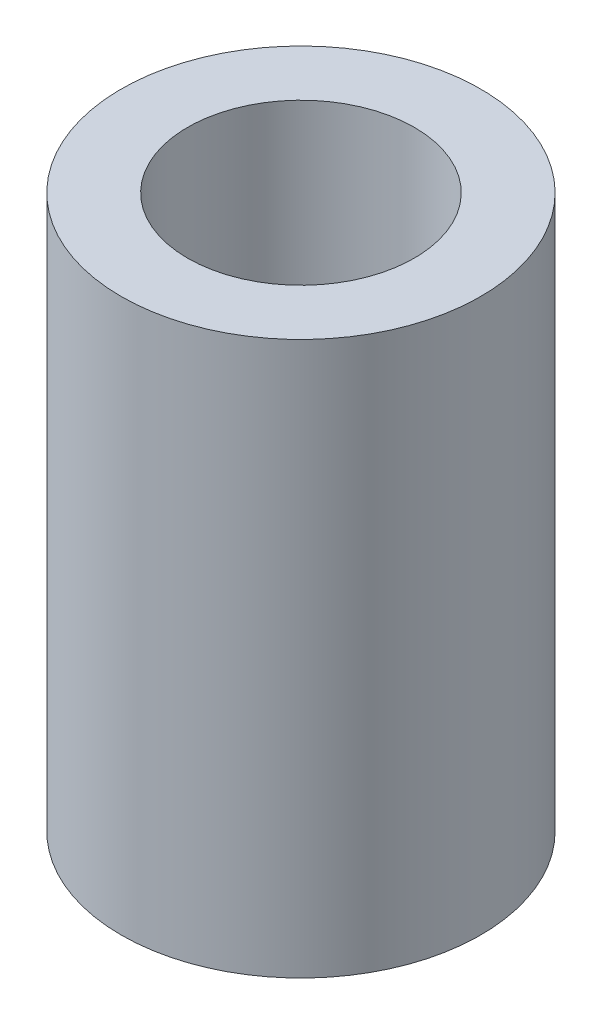
ISO-10303-21;
HEADER;
FILE_DESCRIPTION(('STEP AP214'),'2;1');
FILE_NAME('part.step','',(''),(''),'','','');
FILE_SCHEMA(('AUTOMOTIVE_DESIGN { 1 0 10303 214 1 1 1 1 }'));
ENDSEC;
DATA;
#1=APPLICATION_CONTEXT('core data for automotive mechanical design processes');
#2=APPLICATION_PROTOCOL_DEFINITION('international standard','automotive_design',2000,#1);
#3=PRODUCT_CONTEXT('',#1,'mechanical');
#4=PRODUCT('Part','Part','',(#3));
#5=PRODUCT_RELATED_PRODUCT_CATEGORY('part','',(#4));
#6=PRODUCT_DEFINITION_FORMATION('','',#4);
#7=PRODUCT_DEFINITION_CONTEXT('part definition',#1,'design');
#8=PRODUCT_DEFINITION('design','',#6,#7);
#9=PRODUCT_DEFINITION_SHAPE('','',#8);
#10=(LENGTH_UNIT() NAMED_UNIT(*) SI_UNIT(.MILLI.,.METRE.));
#11=(NAMED_UNIT(*) PLANE_ANGLE_UNIT() SI_UNIT($,.RADIAN.));
#12=(NAMED_UNIT(*) SI_UNIT($,.STERADIAN.) SOLID_ANGLE_UNIT());
#13=UNCERTAINTY_MEASURE_WITH_UNIT(LENGTH_MEASURE(1.E-05),#10,'distance_accuracy_value','');
#14=(GEOMETRIC_REPRESENTATION_CONTEXT(3) GLOBAL_UNCERTAINTY_ASSIGNED_CONTEXT((#13)) GLOBAL_UNIT_ASSIGNED_CONTEXT((#10,
#11,#12)) REPRESENTATION_CONTEXT('',''));
#15=CARTESIAN_POINT('',(0.,0.,0.));
#16=DIRECTION('',(0.,0.,1.));
#17=DIRECTION('',(1.,0.,0.));
#18=AXIS2_PLACEMENT_3D('',#15,#16,#17);
#19=CARTESIAN_POINT('',(0.,20.,0.));
#20=DIRECTION('',(0.,1.,0.));
#21=DIRECTION('',(0.,0.,1.));
#22=AXIS2_PLACEMENT_3D('',#19,#20,#21);
#23=PLANE('',#22);
#24=CARTESIAN_POINT('',(0.,20.,0.));
#25=DIRECTION('',(0.,1.,0.));
#26=DIRECTION('',(0.,0.,1.));
#27=AXIS2_PLACEMENT_3D('',#24,#25,#26);
#28=CIRCLE('',#27,6.5);
#29=CARTESIAN_POINT('',(0.,20.,6.5));
#30=VERTEX_POINT('',#29);
#31=EDGE_CURVE('E10',#30,#30,#28,.T.);
#32=ORIENTED_EDGE('',*,*,#31,.T.);
#33=EDGE_LOOP('',(#32));
#34=FACE_BOUND('',#33,.T.);
#35=CARTESIAN_POINT('',(0.,20.,0.));
#36=DIRECTION('',(0.,1.,0.));
#37=DIRECTION('',(0.,0.,1.));
#38=AXIS2_PLACEMENT_3D('',#35,#36,#37);
#39=CIRCLE('',#38,4.1);
#40=CARTESIAN_POINT('',(0.,20.,4.1));
#41=VERTEX_POINT('',#40);
#42=EDGE_CURVE('E44',#41,#41,#39,.T.);
#43=ORIENTED_EDGE('',*,*,#42,.F.);
#44=EDGE_LOOP('',(#43));
#45=FACE_BOUND('',#44,.T.);
#46=ADVANCED_FACE('F33',(#34,#45),#23,.T.);
#47=CARTESIAN_POINT('',(0.,0.,0.));
#48=DIRECTION('',(0.,1.,0.));
#49=DIRECTION('',(0.,0.,1.));
#50=AXIS2_PLACEMENT_3D('',#47,#48,#49);
#51=PLANE('',#50);
#52=CARTESIAN_POINT('',(0.,0.,0.));
#53=DIRECTION('',(0.,1.,0.));
#54=DIRECTION('',(0.,0.,1.));
#55=AXIS2_PLACEMENT_3D('',#52,#53,#54);
#56=CIRCLE('',#55,6.5);
#57=CARTESIAN_POINT('',(0.,0.,6.5));
#58=VERTEX_POINT('',#57);
#59=EDGE_CURVE('E37',#58,#58,#56,.T.);
#60=ORIENTED_EDGE('',*,*,#59,.F.);
#61=EDGE_LOOP('',(#60));
#62=FACE_BOUND('',#61,.T.);
#63=CARTESIAN_POINT('',(0.,0.,0.));
#64=DIRECTION('',(0.,1.,0.));
#65=DIRECTION('',(0.,0.,1.));
#66=AXIS2_PLACEMENT_3D('',#63,#64,#65);
#67=CIRCLE('',#66,4.1);
#68=CARTESIAN_POINT('',(0.,0.,4.1));
#69=VERTEX_POINT('',#68);
#70=EDGE_CURVE('E46',#69,#69,#67,.T.);
#71=ORIENTED_EDGE('',*,*,#70,.T.);
#72=EDGE_LOOP('',(#71));
#73=FACE_BOUND('',#72,.T.);
#74=ADVANCED_FACE('F56',(#62,#73),#51,.F.);
#75=CARTESIAN_POINT('',(0.,20.,0.));
#76=DIRECTION('',(0.,-1.,0.));
#77=DIRECTION('',(0.,0.,-1.));
#78=AXIS2_PLACEMENT_3D('',#75,#76,#77);
#79=CYLINDRICAL_SURFACE('',#78,6.5);
#80=ORIENTED_EDGE('',*,*,#31,.F.);
#81=EDGE_LOOP('',(#80));
#82=FACE_BOUND('',#81,.T.);
#83=ORIENTED_EDGE('',*,*,#59,.T.);
#84=EDGE_LOOP('',(#83));
#85=FACE_BOUND('',#84,.T.);
#86=ADVANCED_FACE('F35',(#82,#85),#79,.T.);
#87=CARTESIAN_POINT('',(0.,20.,0.));
#88=DIRECTION('',(0.,-1.,0.));
#89=DIRECTION('',(0.,0.,-1.));
#90=AXIS2_PLACEMENT_3D('',#87,#88,#89);
#91=CYLINDRICAL_SURFACE('',#90,4.1);
#92=ORIENTED_EDGE('',*,*,#42,.T.);
#93=EDGE_LOOP('',(#92));
#94=FACE_BOUND('',#93,.T.);
#95=ORIENTED_EDGE('',*,*,#70,.F.);
#96=EDGE_LOOP('',(#95));
#97=FACE_BOUND('',#96,.T.);
#98=ADVANCED_FACE('F52',(#94,#97),#91,.F.);
#99=CLOSED_SHELL('',(#46,#74,#86,#98));
#100=MANIFOLD_SOLID_BREP('B2',#99);
#101=ADVANCED_BREP_SHAPE_REPRESENTATION('',(#18,#100),#14);
#102=SHAPE_DEFINITION_REPRESENTATION(#9,#101);
ENDSEC;
END-ISO-10303-21;
